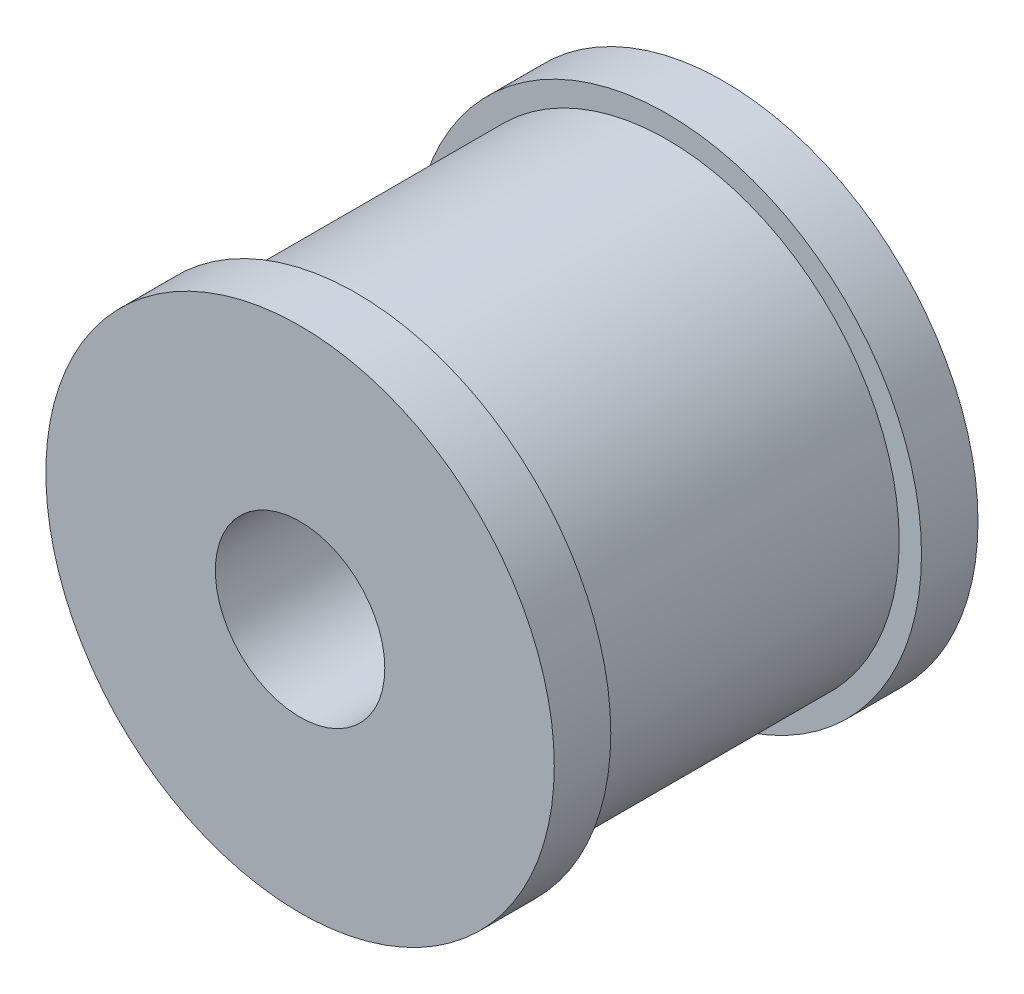
ISO-10303-21;
HEADER;
FILE_DESCRIPTION(('STEP AP214'),'2;1');
FILE_NAME('part.step','',(''),(''),'','','');
FILE_SCHEMA(('AUTOMOTIVE_DESIGN { 1 0 10303 214 1 1 1 1 }'));
ENDSEC;
DATA;
#1=APPLICATION_CONTEXT('core data for automotive mechanical design processes');
#2=APPLICATION_PROTOCOL_DEFINITION('international standard','automotive_design',2000,#1);
#3=PRODUCT_CONTEXT('',#1,'mechanical');
#4=PRODUCT('Part','Part','',(#3));
#5=PRODUCT_RELATED_PRODUCT_CATEGORY('part','',(#4));
#6=PRODUCT_DEFINITION_FORMATION('','',#4);
#7=PRODUCT_DEFINITION_CONTEXT('part definition',#1,'design');
#8=PRODUCT_DEFINITION('design','',#6,#7);
#9=PRODUCT_DEFINITION_SHAPE('','',#8);
#10=(LENGTH_UNIT() NAMED_UNIT(*) SI_UNIT(.MILLI.,.METRE.));
#11=(NAMED_UNIT(*) PLANE_ANGLE_UNIT() SI_UNIT($,.RADIAN.));
#12=(NAMED_UNIT(*) SI_UNIT($,.STERADIAN.) SOLID_ANGLE_UNIT());
#13=UNCERTAINTY_MEASURE_WITH_UNIT(LENGTH_MEASURE(1.E-05),#10,'distance_accuracy_value','');
#14=(GEOMETRIC_REPRESENTATION_CONTEXT(3) GLOBAL_UNCERTAINTY_ASSIGNED_CONTEXT((#13)) GLOBAL_UNIT_ASSIGNED_CONTEXT((#10,
#11,#12)) REPRESENTATION_CONTEXT('',''));
#15=CARTESIAN_POINT('',(0.,0.,0.));
#16=DIRECTION('',(0.,0.,1.));
#17=DIRECTION('',(1.,0.,0.));
#18=AXIS2_PLACEMENT_3D('',#15,#16,#17);
#19=CARTESIAN_POINT('',(0.,0.,15.));
#20=DIRECTION('',(0.,0.,-1.));
#21=DIRECTION('',(-1.,0.,0.));
#22=AXIS2_PLACEMENT_3D('',#19,#20,#21);
#23=CYLINDRICAL_SURFACE('',#22,9.);
#24=CARTESIAN_POINT('',(0.,0.,0.));
#25=DIRECTION('',(0.,0.,1.));
#26=DIRECTION('',(1.,0.,0.));
#27=AXIS2_PLACEMENT_3D('',#24,#25,#26);
#28=CIRCLE('',#27,9.);
#29=CARTESIAN_POINT('',(9.,0.,0.));
#30=VERTEX_POINT('',#29);
#31=EDGE_CURVE('E58',#30,#30,#28,.T.);
#32=ORIENTED_EDGE('',*,*,#31,.T.);
#33=EDGE_LOOP('',(#32));
#34=FACE_BOUND('',#33,.T.);
#35=CARTESIAN_POINT('',(0.,0.,2.));
#36=DIRECTION('',(0.,0.,1.));
#37=DIRECTION('',(1.,0.,0.));
#38=AXIS2_PLACEMENT_3D('',#35,#36,#37);
#39=CIRCLE('',#38,9.);
#40=CARTESIAN_POINT('',(9.,0.,2.));
#41=VERTEX_POINT('',#40);
#42=EDGE_CURVE('E69',#41,#41,#39,.T.);
#43=ORIENTED_EDGE('',*,*,#42,.F.);
#44=EDGE_LOOP('',(#43));
#45=FACE_BOUND('',#44,.T.);
#46=ADVANCED_FACE('F49',(#34,#45),#23,.T.);
#47=CARTESIAN_POINT('',(0.,0.,15.));
#48=DIRECTION('',(0.,0.,1.));
#49=DIRECTION('',(1.,0.,0.));
#50=AXIS2_PLACEMENT_3D('',#47,#48,#49);
#51=PLANE('',#50);
#52=CARTESIAN_POINT('',(0.,0.,15.));
#53=DIRECTION('',(0.,0.,1.));
#54=DIRECTION('',(1.,0.,0.));
#55=AXIS2_PLACEMENT_3D('',#52,#53,#54);
#56=CIRCLE('',#55,9.);
#57=CARTESIAN_POINT('',(9.,0.,15.));
#58=VERTEX_POINT('',#57);
#59=EDGE_CURVE('E11',#58,#58,#56,.T.);
#60=ORIENTED_EDGE('',*,*,#59,.T.);
#61=EDGE_LOOP('',(#60));
#62=FACE_BOUND('',#61,.T.);
#63=CARTESIAN_POINT('',(0.,0.,15.));
#64=DIRECTION('',(0.,0.,1.));
#65=DIRECTION('',(1.,0.,0.));
#66=AXIS2_PLACEMENT_3D('',#63,#64,#65);
#67=CIRCLE('',#66,3.);
#68=CARTESIAN_POINT('',(3.,0.,15.));
#69=VERTEX_POINT('',#68);
#70=EDGE_CURVE('E64',#69,#69,#67,.T.);
#71=ORIENTED_EDGE('',*,*,#70,.F.);
#72=EDGE_LOOP('',(#71));
#73=FACE_BOUND('',#72,.T.);
#74=ADVANCED_FACE('F109',(#62,#73),#51,.T.);
#75=CARTESIAN_POINT('',(0.,0.,0.));
#76=DIRECTION('',(0.,0.,1.));
#77=DIRECTION('',(1.,0.,0.));
#78=AXIS2_PLACEMENT_3D('',#75,#76,#77);
#79=PLANE('',#78);
#80=ORIENTED_EDGE('',*,*,#31,.F.);
#81=EDGE_LOOP('',(#80));
#82=FACE_BOUND('',#81,.T.);
#83=CARTESIAN_POINT('',(0.,0.,0.));
#84=DIRECTION('',(0.,0.,1.));
#85=DIRECTION('',(1.,0.,0.));
#86=AXIS2_PLACEMENT_3D('',#83,#84,#85);
#87=CIRCLE('',#86,3.);
#88=CARTESIAN_POINT('',(3.,0.,0.));
#89=VERTEX_POINT('',#88);
#90=EDGE_CURVE('E67',#89,#89,#87,.T.);
#91=ORIENTED_EDGE('',*,*,#90,.T.);
#92=EDGE_LOOP('',(#91));
#93=FACE_BOUND('',#92,.T.);
#94=ADVANCED_FACE('F94',(#82,#93),#79,.F.);
#95=CARTESIAN_POINT('',(0.,0.,13.));
#96=DIRECTION('',(0.,0.,1.));
#97=DIRECTION('',(1.,0.,0.));
#98=AXIS2_PLACEMENT_3D('',#95,#96,#97);
#99=CIRCLE('',#98,9.);
#100=CARTESIAN_POINT('',(9.,0.,13.));
#101=VERTEX_POINT('',#100);
#102=EDGE_CURVE('E53',#101,#101,#99,.T.);
#103=ORIENTED_EDGE('',*,*,#102,.T.);
#104=EDGE_LOOP('',(#103));
#105=FACE_BOUND('',#104,.T.);
#106=ORIENTED_EDGE('',*,*,#59,.F.);
#107=EDGE_LOOP('',(#106));
#108=FACE_BOUND('',#107,.T.);
#109=ADVANCED_FACE('F51',(#105,#108),#23,.T.);
#110=CARTESIAN_POINT('',(0.,0.,15.));
#111=DIRECTION('',(0.,0.,-1.));
#112=DIRECTION('',(-1.,0.,0.));
#113=AXIS2_PLACEMENT_3D('',#110,#111,#112);
#114=CYLINDRICAL_SURFACE('',#113,3.);
#115=ORIENTED_EDGE('',*,*,#70,.T.);
#116=EDGE_LOOP('',(#115));
#117=FACE_BOUND('',#116,.T.);
#118=ORIENTED_EDGE('',*,*,#90,.F.);
#119=EDGE_LOOP('',(#118));
#120=FACE_BOUND('',#119,.T.);
#121=ADVANCED_FACE('F96',(#117,#120),#114,.F.);
#122=CARTESIAN_POINT('',(0.,0.,13.));
#123=DIRECTION('',(0.,0.,1.));
#124=DIRECTION('',(1.,0.,0.));
#125=AXIS2_PLACEMENT_3D('',#122,#123,#124);
#126=PLANE('',#125);
#127=CARTESIAN_POINT('',(0.,0.,13.));
#128=DIRECTION('',(0.,0.,1.));
#129=DIRECTION('',(1.,0.,0.));
#130=AXIS2_PLACEMENT_3D('',#127,#128,#129);
#131=CIRCLE('',#130,8.21);
#132=CARTESIAN_POINT('',(8.21,0.,13.));
#133=VERTEX_POINT('',#132);
#134=EDGE_CURVE('E72',#133,#133,#131,.T.);
#135=ORIENTED_EDGE('',*,*,#134,.T.);
#136=EDGE_LOOP('',(#135));
#137=FACE_BOUND('',#136,.T.);
#138=ORIENTED_EDGE('',*,*,#102,.F.);
#139=EDGE_LOOP('',(#138));
#140=FACE_BOUND('',#139,.T.);
#141=ADVANCED_FACE('F98',(#137,#140),#126,.F.);
#142=CARTESIAN_POINT('',(0.,0.,2.));
#143=DIRECTION('',(0.,0.,1.));
#144=DIRECTION('',(1.,0.,0.));
#145=AXIS2_PLACEMENT_3D('',#142,#143,#144);
#146=PLANE('',#145);
#147=CARTESIAN_POINT('',(0.,0.,2.));
#148=DIRECTION('',(0.,0.,1.));
#149=DIRECTION('',(1.,0.,0.));
#150=AXIS2_PLACEMENT_3D('',#147,#148,#149);
#151=CIRCLE('',#150,8.21);
#152=CARTESIAN_POINT('',(8.21,0.,2.));
#153=VERTEX_POINT('',#152);
#154=EDGE_CURVE('E79',#153,#153,#151,.T.);
#155=ORIENTED_EDGE('',*,*,#154,.F.);
#156=EDGE_LOOP('',(#155));
#157=FACE_BOUND('',#156,.T.);
#158=ORIENTED_EDGE('',*,*,#42,.T.);
#159=EDGE_LOOP('',(#158));
#160=FACE_BOUND('',#159,.T.);
#161=ADVANCED_FACE('F104',(#157,#160),#146,.T.);
#162=CARTESIAN_POINT('',(0.,0.,13.));
#163=DIRECTION('',(0.,0.,-1.));
#164=DIRECTION('',(-1.,0.,0.));
#165=AXIS2_PLACEMENT_3D('',#162,#163,#164);
#166=CYLINDRICAL_SURFACE('',#165,8.21);
#167=ORIENTED_EDGE('',*,*,#134,.F.);
#168=EDGE_LOOP('',(#167));
#169=FACE_BOUND('',#168,.T.);
#170=ORIENTED_EDGE('',*,*,#154,.T.);
#171=EDGE_LOOP('',(#170));
#172=FACE_BOUND('',#171,.T.);
#173=ADVANCED_FACE('F144',(#169,#172),#166,.T.);
#174=CLOSED_SHELL('',(#46,#74,#94,#109,#121,#141,#161,#173));
#175=MANIFOLD_SOLID_BREP('B2',#174);
#176=ADVANCED_BREP_SHAPE_REPRESENTATION('',(#18,#175),#14);
#177=SHAPE_DEFINITION_REPRESENTATION(#9,#176);
ENDSEC;
END-ISO-10303-21;
